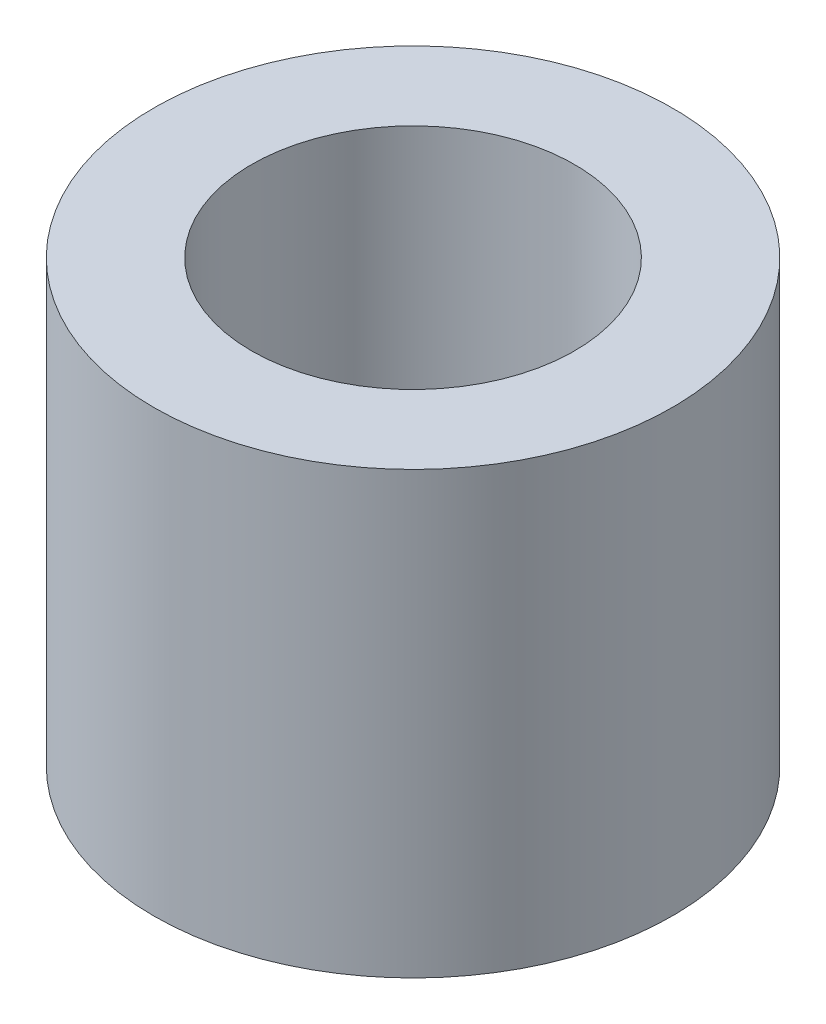
ISO-10303-21;
HEADER;
FILE_DESCRIPTION(('STEP AP214'),'2;1');
FILE_NAME('part.step','',(''),(''),'','','');
FILE_SCHEMA(('AUTOMOTIVE_DESIGN { 1 0 10303 214 1 1 1 1 }'));
ENDSEC;
DATA;
#1=APPLICATION_CONTEXT('core data for automotive mechanical design processes');
#2=APPLICATION_PROTOCOL_DEFINITION('international standard','automotive_design',2000,#1);
#3=PRODUCT_CONTEXT('',#1,'mechanical');
#4=PRODUCT('Part','Part','',(#3));
#5=PRODUCT_RELATED_PRODUCT_CATEGORY('part','',(#4));
#6=PRODUCT_DEFINITION_FORMATION('','',#4);
#7=PRODUCT_DEFINITION_CONTEXT('part definition',#1,'design');
#8=PRODUCT_DEFINITION('design','',#6,#7);
#9=PRODUCT_DEFINITION_SHAPE('','',#8);
#10=(LENGTH_UNIT() NAMED_UNIT(*) SI_UNIT(.MILLI.,.METRE.));
#11=(NAMED_UNIT(*) PLANE_ANGLE_UNIT() SI_UNIT($,.RADIAN.));
#12=(NAMED_UNIT(*) SI_UNIT($,.STERADIAN.) SOLID_ANGLE_UNIT());
#13=UNCERTAINTY_MEASURE_WITH_UNIT(LENGTH_MEASURE(1.E-05),#10,'distance_accuracy_value','');
#14=(GEOMETRIC_REPRESENTATION_CONTEXT(3) GLOBAL_UNCERTAINTY_ASSIGNED_CONTEXT((#13)) GLOBAL_UNIT_ASSIGNED_CONTEXT((#10,
#11,#12)) REPRESENTATION_CONTEXT('',''));
#15=CARTESIAN_POINT('',(0.,0.,0.));
#16=DIRECTION('',(0.,0.,1.));
#17=DIRECTION('',(1.,0.,0.));
#18=AXIS2_PLACEMENT_3D('',#15,#16,#17);
#19=CARTESIAN_POINT('',(0.,4.5,0.));
#20=DIRECTION('',(0.,1.,0.));
#21=DIRECTION('',(0.,0.,1.));
#22=AXIS2_PLACEMENT_3D('',#19,#20,#21);
#23=PLANE('',#22);
#24=CARTESIAN_POINT('',(0.,4.5,0.));
#25=DIRECTION('',(0.,1.,0.));
#26=DIRECTION('',(0.,0.,1.));
#27=AXIS2_PLACEMENT_3D('',#24,#25,#26);
#28=CIRCLE('',#27,2.65);
#29=CARTESIAN_POINT('',(0.,4.5,2.65));
#30=VERTEX_POINT('',#29);
#31=EDGE_CURVE('E10',#30,#30,#28,.T.);
#32=ORIENTED_EDGE('',*,*,#31,.T.);
#33=EDGE_LOOP('',(#32));
#34=FACE_BOUND('',#33,.T.);
#35=CARTESIAN_POINT('',(0.,4.5,0.));
#36=DIRECTION('',(0.,1.,0.));
#37=DIRECTION('',(0.,0.,1.));
#38=AXIS2_PLACEMENT_3D('',#35,#36,#37);
#39=CIRCLE('',#38,1.65);
#40=CARTESIAN_POINT('',(0.,4.5,1.65));
#41=VERTEX_POINT('',#40);
#42=EDGE_CURVE('E54',#41,#41,#39,.T.);
#43=ORIENTED_EDGE('',*,*,#42,.F.);
#44=EDGE_LOOP('',(#43));
#45=FACE_BOUND('',#44,.T.);
#46=ADVANCED_FACE('F41',(#34,#45),#23,.T.);
#47=CARTESIAN_POINT('',(0.,0.,0.));
#48=DIRECTION('',(0.,1.,0.));
#49=DIRECTION('',(0.,0.,1.));
#50=AXIS2_PLACEMENT_3D('',#47,#48,#49);
#51=PLANE('',#50);
#52=CARTESIAN_POINT('',(0.,0.,0.));
#53=DIRECTION('',(0.,1.,0.));
#54=DIRECTION('',(0.,0.,1.));
#55=AXIS2_PLACEMENT_3D('',#52,#53,#54);
#56=CIRCLE('',#55,2.65);
#57=CARTESIAN_POINT('',(0.,0.,2.65));
#58=VERTEX_POINT('',#57);
#59=EDGE_CURVE('E45',#58,#58,#56,.T.);
#60=ORIENTED_EDGE('',*,*,#59,.F.);
#61=EDGE_LOOP('',(#60));
#62=FACE_BOUND('',#61,.T.);
#63=CARTESIAN_POINT('',(0.,0.,0.));
#64=DIRECTION('',(0.,1.,0.));
#65=DIRECTION('',(0.,0.,1.));
#66=AXIS2_PLACEMENT_3D('',#63,#64,#65);
#67=CIRCLE('',#66,1.65);
#68=CARTESIAN_POINT('',(0.,0.,1.65));
#69=VERTEX_POINT('',#68);
#70=EDGE_CURVE('E56',#69,#69,#67,.T.);
#71=ORIENTED_EDGE('',*,*,#70,.T.);
#72=EDGE_LOOP('',(#71));
#73=FACE_BOUND('',#72,.T.);
#74=ADVANCED_FACE('F68',(#62,#73),#51,.F.);
#75=CARTESIAN_POINT('',(0.,4.5,0.));
#76=DIRECTION('',(0.,-1.,0.));
#77=DIRECTION('',(0.,0.,-1.));
#78=AXIS2_PLACEMENT_3D('',#75,#76,#77);
#79=CYLINDRICAL_SURFACE('',#78,2.65);
#80=ORIENTED_EDGE('',*,*,#31,.F.);
#81=EDGE_LOOP('',(#80));
#82=FACE_BOUND('',#81,.T.);
#83=ORIENTED_EDGE('',*,*,#59,.T.);
#84=EDGE_LOOP('',(#83));
#85=FACE_BOUND('',#84,.T.);
#86=ADVANCED_FACE('F43',(#82,#85),#79,.T.);
#87=CARTESIAN_POINT('',(0.,4.5,0.));
#88=DIRECTION('',(0.,-1.,0.));
#89=DIRECTION('',(0.,0.,-1.));
#90=AXIS2_PLACEMENT_3D('',#87,#88,#89);
#91=CYLINDRICAL_SURFACE('',#90,1.65);
#92=ORIENTED_EDGE('',*,*,#42,.T.);
#93=EDGE_LOOP('',(#92));
#94=FACE_BOUND('',#93,.T.);
#95=ORIENTED_EDGE('',*,*,#70,.F.);
#96=EDGE_LOOP('',(#95));
#97=FACE_BOUND('',#96,.T.);
#98=ADVANCED_FACE('F64',(#94,#97),#91,.F.);
#99=CLOSED_SHELL('',(#46,#74,#86,#98));
#100=MANIFOLD_SOLID_BREP('B2',#99);
#101=ADVANCED_BREP_SHAPE_REPRESENTATION('',(#18,#100),#14);
#102=SHAPE_DEFINITION_REPRESENTATION(#9,#101);
ENDSEC;
END-ISO-10303-21;
